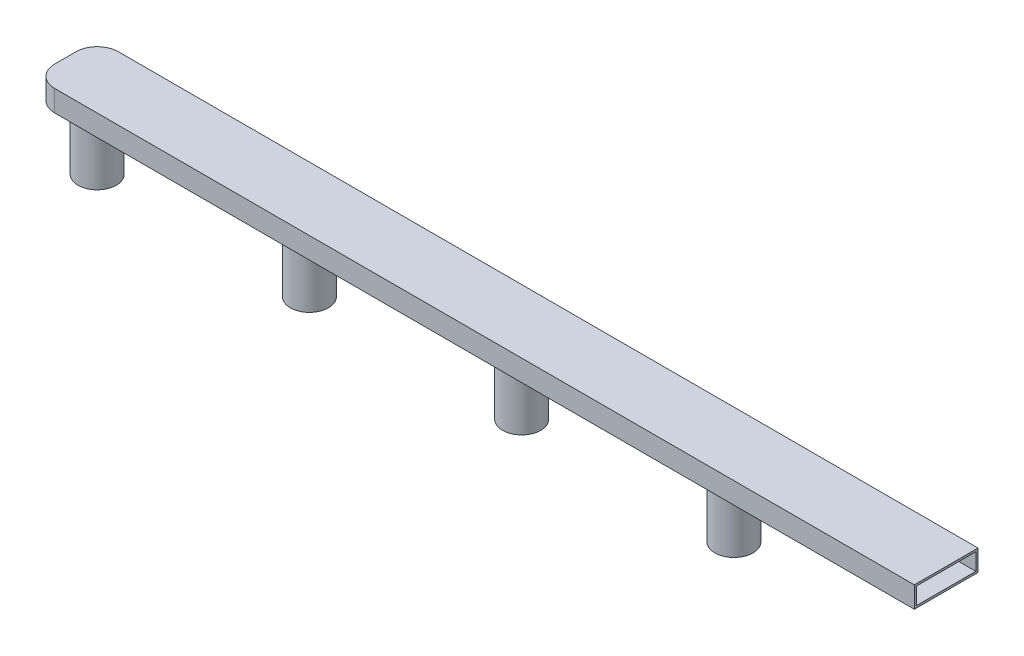
ISO-10303-21;
HEADER;
FILE_DESCRIPTION(('STEP AP214'),'2;1');
FILE_NAME('part.step','',(''),(''),'','','');
FILE_SCHEMA(('AUTOMOTIVE_DESIGN { 1 0 10303 214 1 1 1 1 }'));
ENDSEC;
DATA;
#1=APPLICATION_CONTEXT('core data for automotive mechanical design processes');
#2=APPLICATION_PROTOCOL_DEFINITION('international standard','automotive_design',2000,#1);
#3=PRODUCT_CONTEXT('',#1,'mechanical');
#4=PRODUCT('Part','Part','',(#3));
#5=PRODUCT_RELATED_PRODUCT_CATEGORY('part','',(#4));
#6=PRODUCT_DEFINITION_FORMATION('','',#4);
#7=PRODUCT_DEFINITION_CONTEXT('part definition',#1,'design');
#8=PRODUCT_DEFINITION('design','',#6,#7);
#9=PRODUCT_DEFINITION_SHAPE('','',#8);
#10=(LENGTH_UNIT() NAMED_UNIT(*) SI_UNIT(.MILLI.,.METRE.));
#11=(NAMED_UNIT(*) PLANE_ANGLE_UNIT() SI_UNIT($,.RADIAN.));
#12=(NAMED_UNIT(*) SI_UNIT($,.STERADIAN.) SOLID_ANGLE_UNIT());
#13=UNCERTAINTY_MEASURE_WITH_UNIT(LENGTH_MEASURE(1.E-05),#10,'distance_accuracy_value','');
#14=(GEOMETRIC_REPRESENTATION_CONTEXT(3) GLOBAL_UNCERTAINTY_ASSIGNED_CONTEXT((#13)) GLOBAL_UNIT_ASSIGNED_CONTEXT((#10,
#11,#12)) REPRESENTATION_CONTEXT('',''));
#15=CARTESIAN_POINT('',(0.,0.,0.));
#16=DIRECTION('',(0.,0.,1.));
#17=DIRECTION('',(1.,0.,0.));
#18=AXIS2_PLACEMENT_3D('',#15,#16,#17);
#19=CARTESIAN_POINT('',(250.,10.,-15.));
#20=DIRECTION('',(-1.,0.,0.));
#21=DIRECTION('',(0.,0.,1.));
#22=AXIS2_PLACEMENT_3D('',#19,#20,#21);
#23=PLANE('',#22);
#24=DIRECTION('',(0.,0.,-1.));
#25=VECTOR('',#24,1.);
#26=CARTESIAN_POINT('',(250.,0.,-15.));
#27=LINE('',#26,#25);
#28=CARTESIAN_POINT('',(250.,0.,15.));
#29=VERTEX_POINT('',#28);
#30=CARTESIAN_POINT('',(250.,0.,-15.));
#31=VERTEX_POINT('',#30);
#32=EDGE_CURVE('E151',#29,#31,#27,.T.);
#33=ORIENTED_EDGE('',*,*,#32,.T.);
#34=DIRECTION('',(0.,-1.,0.));
#35=VECTOR('',#34,1.);
#36=CARTESIAN_POINT('',(250.,10.,-15.));
#37=LINE('',#36,#35);
#38=CARTESIAN_POINT('',(250.,10.,-15.));
#39=VERTEX_POINT('',#38);
#40=EDGE_CURVE('E12',#39,#31,#37,.T.);
#41=ORIENTED_EDGE('',*,*,#40,.F.);
#42=DIRECTION('',(0.,0.,-1.));
#43=VECTOR('',#42,1.);
#44=CARTESIAN_POINT('',(250.,10.,-15.));
#45=LINE('',#44,#43);
#46=CARTESIAN_POINT('',(250.,10.,15.));
#47=VERTEX_POINT('',#46);
#48=EDGE_CURVE('E169',#47,#39,#45,.T.);
#49=ORIENTED_EDGE('',*,*,#48,.F.);
#50=DIRECTION('',(0.,-1.,0.));
#51=VECTOR('',#50,1.);
#52=CARTESIAN_POINT('',(250.,10.,15.));
#53=LINE('',#52,#51);
#54=EDGE_CURVE('E147',#47,#29,#53,.T.);
#55=ORIENTED_EDGE('',*,*,#54,.T.);
#56=EDGE_LOOP('',(#33,#41,#49,#55));
#57=FACE_BOUND('',#56,.T.);
#58=DIRECTION('',(0.,0.,-1.));
#59=VECTOR('',#58,1.);
#60=CARTESIAN_POINT('',(250.,0.999999999999999,-15.));
#61=LINE('',#60,#59);
#62=CARTESIAN_POINT('',(250.,1.,14.));
#63=VERTEX_POINT('',#62);
#64=CARTESIAN_POINT('',(250.,1.,-14.));
#65=VERTEX_POINT('',#64);
#66=EDGE_CURVE('E193',#63,#65,#61,.T.);
#67=ORIENTED_EDGE('',*,*,#66,.F.);
#68=DIRECTION('',(0.,-1.,0.));
#69=VECTOR('',#68,1.);
#70=CARTESIAN_POINT('',(250.,10.,14.));
#71=LINE('',#70,#69);
#72=CARTESIAN_POINT('',(250.,9.,14.));
#73=VERTEX_POINT('',#72);
#74=EDGE_CURVE('E199',#73,#63,#71,.T.);
#75=ORIENTED_EDGE('',*,*,#74,.F.);
#76=DIRECTION('',(0.,0.,-1.));
#77=VECTOR('',#76,1.);
#78=CARTESIAN_POINT('',(250.,9.,-15.));
#79=LINE('',#78,#77);
#80=CARTESIAN_POINT('',(250.,9.,-14.));
#81=VERTEX_POINT('',#80);
#82=EDGE_CURVE('E65',#73,#81,#79,.T.);
#83=ORIENTED_EDGE('',*,*,#82,.T.);
#84=DIRECTION('',(0.,-1.,0.));
#85=VECTOR('',#84,1.);
#86=CARTESIAN_POINT('',(250.,10.,-14.));
#87=LINE('',#86,#85);
#88=EDGE_CURVE('E156',#81,#65,#87,.T.);
#89=ORIENTED_EDGE('',*,*,#88,.T.);
#90=EDGE_LOOP('',(#67,#75,#83,#89));
#91=FACE_BOUND('',#90,.T.);
#92=ADVANCED_FACE('F50',(#57,#91),#23,.F.);
#93=CARTESIAN_POINT('',(-155.,10.,-15.));
#94=DIRECTION('',(0.,0.,1.));
#95=DIRECTION('',(1.,0.,0.));
#96=AXIS2_PLACEMENT_3D('',#93,#94,#95);
#97=PLANE('',#96);
#98=DIRECTION('',(-1.,0.,0.));
#99=VECTOR('',#98,1.);
#100=CARTESIAN_POINT('',(-155.,0.,-15.));
#101=LINE('',#100,#99);
#102=CARTESIAN_POINT('',(-155.,0.,-15.));
#103=VERTEX_POINT('',#102);
#104=EDGE_CURVE('E155',#31,#103,#101,.T.);
#105=ORIENTED_EDGE('',*,*,#104,.T.);
#106=DIRECTION('',(0.,-1.,0.));
#107=VECTOR('',#106,1.);
#108=CARTESIAN_POINT('',(-155.,10.,-15.));
#109=LINE('',#108,#107);
#110=CARTESIAN_POINT('',(-155.,10.,-15.));
#111=VERTEX_POINT('',#110);
#112=EDGE_CURVE('E58',#111,#103,#109,.T.);
#113=ORIENTED_EDGE('',*,*,#112,.F.);
#114=DIRECTION('',(-1.,0.,0.));
#115=VECTOR('',#114,1.);
#116=CARTESIAN_POINT('',(-155.,10.,-15.));
#117=LINE('',#116,#115);
#118=EDGE_CURVE('E109',#39,#111,#117,.T.);
#119=ORIENTED_EDGE('',*,*,#118,.F.);
#120=ORIENTED_EDGE('',*,*,#40,.T.);
#121=EDGE_LOOP('',(#105,#113,#119,#120));
#122=FACE_BOUND('',#121,.T.);
#123=ADVANCED_FACE('F303',(#122),#97,.F.);
#124=CARTESIAN_POINT('',(-155.,10.,-5.));
#125=DIRECTION('',(0.,-1.,0.));
#126=DIRECTION('',(0.,0.,-1.));
#127=AXIS2_PLACEMENT_3D('',#124,#125,#126);
#128=CYLINDRICAL_SURFACE('',#127,10.);
#129=CARTESIAN_POINT('',(-155.,0.,-5.));
#130=DIRECTION('',(0.,1.,0.));
#131=DIRECTION('',(0.,0.,1.));
#132=AXIS2_PLACEMENT_3D('',#129,#130,#131);
#133=CIRCLE('',#132,10.);
#134=CARTESIAN_POINT('',(-165.,0.,-5.));
#135=VERTEX_POINT('',#134);
#136=EDGE_CURVE('E159',#103,#135,#133,.T.);
#137=ORIENTED_EDGE('',*,*,#136,.T.);
#138=DIRECTION('',(0.,-1.,0.));
#139=VECTOR('',#138,1.);
#140=CARTESIAN_POINT('',(-165.,10.,-5.));
#141=LINE('',#140,#139);
#142=CARTESIAN_POINT('',(-165.,10.,-5.));
#143=VERTEX_POINT('',#142);
#144=EDGE_CURVE('E140',#143,#135,#141,.T.);
#145=ORIENTED_EDGE('',*,*,#144,.F.);
#146=CARTESIAN_POINT('',(-155.,10.,-5.));
#147=DIRECTION('',(0.,1.,0.));
#148=DIRECTION('',(0.,0.,1.));
#149=AXIS2_PLACEMENT_3D('',#146,#147,#148);
#150=CIRCLE('',#149,10.);
#151=EDGE_CURVE('E126',#111,#143,#150,.T.);
#152=ORIENTED_EDGE('',*,*,#151,.F.);
#153=ORIENTED_EDGE('',*,*,#112,.T.);
#154=EDGE_LOOP('',(#137,#145,#152,#153));
#155=FACE_BOUND('',#154,.T.);
#156=ADVANCED_FACE('F179',(#155),#128,.T.);
#157=CARTESIAN_POINT('',(-165.,10.,-5.));
#158=DIRECTION('',(1.,0.,0.));
#159=DIRECTION('',(0.,0.,-1.));
#160=AXIS2_PLACEMENT_3D('',#157,#158,#159);
#161=PLANE('',#160);
#162=DIRECTION('',(0.,0.,1.));
#163=VECTOR('',#162,1.);
#164=CARTESIAN_POINT('',(-165.,0.,-5.));
#165=LINE('',#164,#163);
#166=CARTESIAN_POINT('',(-165.,0.,5.));
#167=VERTEX_POINT('',#166);
#168=EDGE_CURVE('E136',#135,#167,#165,.T.);
#169=ORIENTED_EDGE('',*,*,#168,.T.);
#170=DIRECTION('',(0.,-1.,0.));
#171=VECTOR('',#170,1.);
#172=CARTESIAN_POINT('',(-165.,10.,5.));
#173=LINE('',#172,#171);
#174=CARTESIAN_POINT('',(-165.,10.,5.));
#175=VERTEX_POINT('',#174);
#176=EDGE_CURVE('E133',#175,#167,#173,.T.);
#177=ORIENTED_EDGE('',*,*,#176,.F.);
#178=DIRECTION('',(0.,0.,1.));
#179=VECTOR('',#178,1.);
#180=CARTESIAN_POINT('',(-165.,10.,-5.));
#181=LINE('',#180,#179);
#182=EDGE_CURVE('E119',#143,#175,#181,.T.);
#183=ORIENTED_EDGE('',*,*,#182,.F.);
#184=ORIENTED_EDGE('',*,*,#144,.T.);
#185=EDGE_LOOP('',(#169,#177,#183,#184));
#186=FACE_BOUND('',#185,.T.);
#187=ADVANCED_FACE('F134',(#186),#161,.F.);
#188=CARTESIAN_POINT('',(-155.,10.,5.));
#189=DIRECTION('',(0.,-1.,0.));
#190=DIRECTION('',(0.,0.,-1.));
#191=AXIS2_PLACEMENT_3D('',#188,#189,#190);
#192=CYLINDRICAL_SURFACE('',#191,10.);
#193=CARTESIAN_POINT('',(-155.,0.,5.));
#194=DIRECTION('',(0.,1.,0.));
#195=DIRECTION('',(0.,0.,1.));
#196=AXIS2_PLACEMENT_3D('',#193,#194,#195);
#197=CIRCLE('',#196,10.);
#198=CARTESIAN_POINT('',(-155.,0.,15.));
#199=VERTEX_POINT('',#198);
#200=EDGE_CURVE('E164',#167,#199,#197,.T.);
#201=ORIENTED_EDGE('',*,*,#200,.T.);
#202=DIRECTION('',(0.,-1.,0.));
#203=VECTOR('',#202,1.);
#204=CARTESIAN_POINT('',(-155.,10.,15.));
#205=LINE('',#204,#203);
#206=CARTESIAN_POINT('',(-155.,10.,15.));
#207=VERTEX_POINT('',#206);
#208=EDGE_CURVE('E141',#207,#199,#205,.T.);
#209=ORIENTED_EDGE('',*,*,#208,.F.);
#210=CARTESIAN_POINT('',(-155.,10.,5.));
#211=DIRECTION('',(0.,1.,0.));
#212=DIRECTION('',(0.,0.,1.));
#213=AXIS2_PLACEMENT_3D('',#210,#211,#212);
#214=CIRCLE('',#213,10.);
#215=EDGE_CURVE('E123',#175,#207,#214,.T.);
#216=ORIENTED_EDGE('',*,*,#215,.F.);
#217=ORIENTED_EDGE('',*,*,#176,.T.);
#218=EDGE_LOOP('',(#201,#209,#216,#217));
#219=FACE_BOUND('',#218,.T.);
#220=ADVANCED_FACE('F143',(#219),#192,.T.);
#221=CARTESIAN_POINT('',(-155.,10.,15.));
#222=DIRECTION('',(0.,0.,-1.));
#223=DIRECTION('',(-1.,0.,0.));
#224=AXIS2_PLACEMENT_3D('',#221,#222,#223);
#225=PLANE('',#224);
#226=DIRECTION('',(1.,0.,0.));
#227=VECTOR('',#226,1.);
#228=CARTESIAN_POINT('',(-155.,0.,15.));
#229=LINE('',#228,#227);
#230=EDGE_CURVE('E101',#199,#29,#229,.T.);
#231=ORIENTED_EDGE('',*,*,#230,.T.);
#232=ORIENTED_EDGE('',*,*,#54,.F.);
#233=DIRECTION('',(1.,0.,0.));
#234=VECTOR('',#233,1.);
#235=CARTESIAN_POINT('',(-155.,10.,15.));
#236=LINE('',#235,#234);
#237=EDGE_CURVE('E74',#207,#47,#236,.T.);
#238=ORIENTED_EDGE('',*,*,#237,.F.);
#239=ORIENTED_EDGE('',*,*,#208,.T.);
#240=EDGE_LOOP('',(#231,#232,#238,#239));
#241=FACE_BOUND('',#240,.T.);
#242=ADVANCED_FACE('F183',(#241),#225,.F.);
#243=CARTESIAN_POINT('',(-155.,10.,5.));
#244=DIRECTION('',(0.,1.,0.));
#245=DIRECTION('',(0.,0.,1.));
#246=AXIS2_PLACEMENT_3D('',#243,#244,#245);
#247=PLANE('',#246);
#248=ORIENTED_EDGE('',*,*,#48,.T.);
#249=ORIENTED_EDGE('',*,*,#118,.T.);
#250=ORIENTED_EDGE('',*,*,#151,.T.);
#251=ORIENTED_EDGE('',*,*,#182,.T.);
#252=ORIENTED_EDGE('',*,*,#215,.T.);
#253=ORIENTED_EDGE('',*,*,#237,.T.);
#254=EDGE_LOOP('',(#248,#249,#250,#251,#252,#253));
#255=FACE_BOUND('',#254,.T.);
#256=ADVANCED_FACE('F121',(#255),#247,.T.);
#257=CARTESIAN_POINT('',(-155.,0.,5.));
#258=DIRECTION('',(0.,1.,0.));
#259=DIRECTION('',(0.,0.,1.));
#260=AXIS2_PLACEMENT_3D('',#257,#258,#259);
#261=PLANE('',#260);
#262=ORIENTED_EDGE('',*,*,#32,.F.);
#263=ORIENTED_EDGE('',*,*,#230,.F.);
#264=ORIENTED_EDGE('',*,*,#200,.F.);
#265=ORIENTED_EDGE('',*,*,#168,.F.);
#266=ORIENTED_EDGE('',*,*,#136,.F.);
#267=ORIENTED_EDGE('',*,*,#104,.F.);
#268=EDGE_LOOP('',(#262,#263,#264,#265,#266,#267));
#269=FACE_BOUND('',#268,.T.);
#270=ADVANCED_FACE('F182',(#269),#261,.F.);
#271=CARTESIAN_POINT('',(-155.,10.,-14.));
#272=DIRECTION('',(0.,0.,1.));
#273=DIRECTION('',(1.,0.,0.));
#274=AXIS2_PLACEMENT_3D('',#271,#272,#273);
#275=PLANE('',#274);
#276=DIRECTION('',(-1.,0.,0.));
#277=VECTOR('',#276,1.);
#278=CARTESIAN_POINT('',(-155.,0.999999999999999,-14.));
#279=LINE('',#278,#277);
#280=CARTESIAN_POINT('',(-155.,0.999999999999999,-14.));
#281=VERTEX_POINT('',#280);
#282=EDGE_CURVE('E198',#65,#281,#279,.T.);
#283=ORIENTED_EDGE('',*,*,#282,.F.);
#284=ORIENTED_EDGE('',*,*,#88,.F.);
#285=DIRECTION('',(-1.,0.,0.));
#286=VECTOR('',#285,1.);
#287=CARTESIAN_POINT('',(-155.,9.,-14.));
#288=LINE('',#287,#286);
#289=CARTESIAN_POINT('',(-155.,9.,-14.));
#290=VERTEX_POINT('',#289);
#291=EDGE_CURVE('E207',#81,#290,#288,.T.);
#292=ORIENTED_EDGE('',*,*,#291,.T.);
#293=DIRECTION('',(0.,-1.,0.));
#294=VECTOR('',#293,1.);
#295=CARTESIAN_POINT('',(-155.,10.,-14.));
#296=LINE('',#295,#294);
#297=EDGE_CURVE('E212',#290,#281,#296,.T.);
#298=ORIENTED_EDGE('',*,*,#297,.T.);
#299=EDGE_LOOP('',(#283,#284,#292,#298));
#300=FACE_BOUND('',#299,.T.);
#301=ADVANCED_FACE('F272',(#300),#275,.T.);
#302=CARTESIAN_POINT('',(-155.,10.,-5.));
#303=DIRECTION('',(0.,-1.,0.));
#304=DIRECTION('',(0.,0.,-1.));
#305=AXIS2_PLACEMENT_3D('',#302,#303,#304);
#306=CYLINDRICAL_SURFACE('',#305,9.00000000000001);
#307=CARTESIAN_POINT('',(-155.,0.999999999999999,-5.));
#308=DIRECTION('',(0.,1.,0.));
#309=DIRECTION('',(0.,0.,1.));
#310=AXIS2_PLACEMENT_3D('',#307,#308,#309);
#311=CIRCLE('',#310,9.00000000000001);
#312=CARTESIAN_POINT('',(-164.,0.999999999999999,-5.));
#313=VERTEX_POINT('',#312);
#314=EDGE_CURVE('E243',#281,#313,#311,.T.);
#315=ORIENTED_EDGE('',*,*,#314,.F.);
#316=ORIENTED_EDGE('',*,*,#297,.F.);
#317=CARTESIAN_POINT('',(-155.,9.,-5.));
#318=DIRECTION('',(0.,1.,0.));
#319=DIRECTION('',(0.,0.,1.));
#320=AXIS2_PLACEMENT_3D('',#317,#318,#319);
#321=CIRCLE('',#320,9.00000000000001);
#322=CARTESIAN_POINT('',(-164.,9.,-5.));
#323=VERTEX_POINT('',#322);
#324=EDGE_CURVE('E235',#290,#323,#321,.T.);
#325=ORIENTED_EDGE('',*,*,#324,.T.);
#326=DIRECTION('',(0.,1.,0.));
#327=VECTOR('',#326,1.);
#328=CARTESIAN_POINT('',(-164.,10.,-5.));
#329=LINE('',#328,#327);
#330=EDGE_CURVE('E239',#323,#313,#329,.F.);
#331=ORIENTED_EDGE('',*,*,#330,.T.);
#332=EDGE_LOOP('',(#315,#316,#325,#331));
#333=FACE_BOUND('',#332,.T.);
#334=ADVANCED_FACE('F276',(#333),#306,.F.);
#335=CARTESIAN_POINT('',(-164.,10.,-5.));
#336=DIRECTION('',(1.,0.,0.));
#337=DIRECTION('',(0.,0.,-1.));
#338=AXIS2_PLACEMENT_3D('',#335,#336,#337);
#339=PLANE('',#338);
#340=DIRECTION('',(0.,0.,1.));
#341=VECTOR('',#340,1.);
#342=CARTESIAN_POINT('',(-164.,0.999999999999999,-5.));
#343=LINE('',#342,#341);
#344=CARTESIAN_POINT('',(-164.,0.999999999999999,5.));
#345=VERTEX_POINT('',#344);
#346=EDGE_CURVE('E231',#313,#345,#343,.T.);
#347=ORIENTED_EDGE('',*,*,#346,.F.);
#348=ORIENTED_EDGE('',*,*,#330,.F.);
#349=DIRECTION('',(0.,0.,1.));
#350=VECTOR('',#349,1.);
#351=CARTESIAN_POINT('',(-164.,9.,-5.));
#352=LINE('',#351,#350);
#353=CARTESIAN_POINT('',(-164.,9.,5.));
#354=VERTEX_POINT('',#353);
#355=EDGE_CURVE('E223',#323,#354,#352,.T.);
#356=ORIENTED_EDGE('',*,*,#355,.T.);
#357=DIRECTION('',(0.,-1.,0.));
#358=VECTOR('',#357,1.);
#359=CARTESIAN_POINT('',(-164.,10.,5.));
#360=LINE('',#359,#358);
#361=EDGE_CURVE('E227',#354,#345,#360,.T.);
#362=ORIENTED_EDGE('',*,*,#361,.T.);
#363=EDGE_LOOP('',(#347,#348,#356,#362));
#364=FACE_BOUND('',#363,.T.);
#365=ADVANCED_FACE('F284',(#364),#339,.T.);
#366=CARTESIAN_POINT('',(-155.,10.,5.));
#367=DIRECTION('',(0.,-1.,0.));
#368=DIRECTION('',(0.,0.,-1.));
#369=AXIS2_PLACEMENT_3D('',#366,#367,#368);
#370=CYLINDRICAL_SURFACE('',#369,9.00000000000001);
#371=CARTESIAN_POINT('',(-155.,0.999999999999999,5.));
#372=DIRECTION('',(0.,1.,0.));
#373=DIRECTION('',(0.,0.,1.));
#374=AXIS2_PLACEMENT_3D('',#371,#372,#373);
#375=CIRCLE('',#374,9.00000000000001);
#376=CARTESIAN_POINT('',(-155.,0.999999999999999,14.));
#377=VERTEX_POINT('',#376);
#378=EDGE_CURVE('E219',#345,#377,#375,.T.);
#379=ORIENTED_EDGE('',*,*,#378,.F.);
#380=ORIENTED_EDGE('',*,*,#361,.F.);
#381=CARTESIAN_POINT('',(-155.,9.,5.));
#382=DIRECTION('',(0.,1.,0.));
#383=DIRECTION('',(0.,0.,1.));
#384=AXIS2_PLACEMENT_3D('',#381,#382,#383);
#385=CIRCLE('',#384,9.00000000000001);
#386=CARTESIAN_POINT('',(-155.,9.,14.));
#387=VERTEX_POINT('',#386);
#388=EDGE_CURVE('E215',#354,#387,#385,.T.);
#389=ORIENTED_EDGE('',*,*,#388,.T.);
#390=DIRECTION('',(0.,1.,0.));
#391=VECTOR('',#390,1.);
#392=CARTESIAN_POINT('',(-155.,10.,14.));
#393=LINE('',#392,#391);
#394=EDGE_CURVE('E203',#387,#377,#393,.F.);
#395=ORIENTED_EDGE('',*,*,#394,.T.);
#396=EDGE_LOOP('',(#379,#380,#389,#395));
#397=FACE_BOUND('',#396,.T.);
#398=ADVANCED_FACE('F329',(#397),#370,.F.);
#399=CARTESIAN_POINT('',(-155.,10.,14.));
#400=DIRECTION('',(0.,0.,-1.));
#401=DIRECTION('',(-1.,0.,0.));
#402=AXIS2_PLACEMENT_3D('',#399,#400,#401);
#403=PLANE('',#402);
#404=DIRECTION('',(1.,0.,0.));
#405=VECTOR('',#404,1.);
#406=CARTESIAN_POINT('',(-155.,0.999999999999999,14.));
#407=LINE('',#406,#405);
#408=EDGE_CURVE('E208',#377,#63,#407,.T.);
#409=ORIENTED_EDGE('',*,*,#408,.F.);
#410=ORIENTED_EDGE('',*,*,#394,.F.);
#411=DIRECTION('',(1.,0.,0.));
#412=VECTOR('',#411,1.);
#413=CARTESIAN_POINT('',(-155.,9.,14.));
#414=LINE('',#413,#412);
#415=EDGE_CURVE('E204',#387,#73,#414,.T.);
#416=ORIENTED_EDGE('',*,*,#415,.T.);
#417=ORIENTED_EDGE('',*,*,#74,.T.);
#418=EDGE_LOOP('',(#409,#410,#416,#417));
#419=FACE_BOUND('',#418,.T.);
#420=ADVANCED_FACE('F301',(#419),#403,.T.);
#421=CARTESIAN_POINT('',(-155.,9.,5.));
#422=DIRECTION('',(0.,1.,0.));
#423=DIRECTION('',(0.,0.,1.));
#424=AXIS2_PLACEMENT_3D('',#421,#422,#423);
#425=PLANE('',#424);
#426=ORIENTED_EDGE('',*,*,#82,.F.);
#427=ORIENTED_EDGE('',*,*,#415,.F.);
#428=ORIENTED_EDGE('',*,*,#388,.F.);
#429=ORIENTED_EDGE('',*,*,#355,.F.);
#430=ORIENTED_EDGE('',*,*,#324,.F.);
#431=ORIENTED_EDGE('',*,*,#291,.F.);
#432=EDGE_LOOP('',(#426,#427,#428,#429,#430,#431));
#433=FACE_BOUND('',#432,.T.);
#434=ADVANCED_FACE('F324',(#433),#425,.F.);
#435=CARTESIAN_POINT('',(-155.,1.,5.));
#436=DIRECTION('',(0.,1.,0.));
#437=DIRECTION('',(0.,0.,1.));
#438=AXIS2_PLACEMENT_3D('',#435,#436,#437);
#439=PLANE('',#438);
#440=ORIENTED_EDGE('',*,*,#66,.T.);
#441=ORIENTED_EDGE('',*,*,#282,.T.);
#442=ORIENTED_EDGE('',*,*,#314,.T.);
#443=ORIENTED_EDGE('',*,*,#346,.T.);
#444=ORIENTED_EDGE('',*,*,#378,.T.);
#445=ORIENTED_EDGE('',*,*,#408,.T.);
#446=EDGE_LOOP('',(#440,#441,#442,#443,#444,#445));
#447=FACE_BOUND('',#446,.T.);
#448=ADVANCED_FACE('F264',(#447),#439,.T.);
#449=CLOSED_SHELL('',(#92,#123,#156,#187,#220,#242,#256,#270,#301,#334,#365,#398,#420,#434,#448));
#450=MANIFOLD_SOLID_BREP('B2',#449);
#451=CARTESIAN_POINT('',(-150.,-30.,0.));
#452=DIRECTION('',(0.,1.,0.));
#453=DIRECTION('',(0.,0.,1.));
#454=AXIS2_PLACEMENT_3D('',#451,#452,#453);
#455=CYLINDRICAL_SURFACE('',#454,9.00000000000001);
#456=CARTESIAN_POINT('',(-150.,-30.,0.));
#457=DIRECTION('',(0.,1.,0.));
#458=DIRECTION('',(0.,0.,1.));
#459=AXIS2_PLACEMENT_3D('',#456,#457,#458);
#460=CIRCLE('',#459,9.00000000000001);
#461=CARTESIAN_POINT('',(-150.,-30.,9.00000000000001));
#462=VERTEX_POINT('',#461);
#463=EDGE_CURVE('E49',#462,#462,#460,.T.);
#464=ORIENTED_EDGE('',*,*,#463,.T.);
#465=EDGE_LOOP('',(#464));
#466=FACE_BOUND('',#465,.T.);
#467=CARTESIAN_POINT('',(-150.,0.,0.));
#468=DIRECTION('',(0.,1.,0.));
#469=DIRECTION('',(0.,0.,1.));
#470=AXIS2_PLACEMENT_3D('',#467,#468,#469);
#471=CIRCLE('',#470,9.00000000000001);
#472=CARTESIAN_POINT('',(-150.,0.,9.00000000000001));
#473=VERTEX_POINT('',#472);
#474=EDGE_CURVE('E440',#473,#473,#471,.T.);
#475=ORIENTED_EDGE('',*,*,#474,.F.);
#476=EDGE_LOOP('',(#475));
#477=FACE_BOUND('',#476,.T.);
#478=ADVANCED_FACE('F437',(#466,#477),#455,.T.);
#479=CARTESIAN_POINT('',(-150.,-30.,0.));
#480=DIRECTION('',(0.,1.,0.));
#481=DIRECTION('',(0.,0.,1.));
#482=AXIS2_PLACEMENT_3D('',#479,#480,#481);
#483=PLANE('',#482);
#484=CARTESIAN_POINT('',(-150.,-30.,0.));
#485=DIRECTION('',(0.,1.,0.));
#486=DIRECTION('',(0.,0.,1.));
#487=AXIS2_PLACEMENT_3D('',#484,#485,#486);
#488=CIRCLE('',#487,6.50000000000002);
#489=CARTESIAN_POINT('',(-150.,-30.,6.50000000000002));
#490=VERTEX_POINT('',#489);
#491=EDGE_CURVE('E447',#490,#490,#488,.T.);
#492=ORIENTED_EDGE('',*,*,#491,.T.);
#493=EDGE_LOOP('',(#492));
#494=FACE_BOUND('',#493,.T.);
#495=ORIENTED_EDGE('',*,*,#463,.F.);
#496=EDGE_LOOP('',(#495));
#497=FACE_BOUND('',#496,.T.);
#498=ADVANCED_FACE('F455',(#494,#497),#483,.F.);
#499=CARTESIAN_POINT('',(-150.,0.,0.));
#500=DIRECTION('',(0.,1.,0.));
#501=DIRECTION('',(0.,0.,1.));
#502=AXIS2_PLACEMENT_3D('',#499,#500,#501);
#503=PLANE('',#502);
#504=CARTESIAN_POINT('',(-150.,0.,0.));
#505=DIRECTION('',(0.,1.,0.));
#506=DIRECTION('',(0.,0.,1.));
#507=AXIS2_PLACEMENT_3D('',#504,#505,#506);
#508=CIRCLE('',#507,6.50000000000002);
#509=CARTESIAN_POINT('',(-150.,0.,6.50000000000002));
#510=VERTEX_POINT('',#509);
#511=EDGE_CURVE('E449',#510,#510,#508,.T.);
#512=ORIENTED_EDGE('',*,*,#511,.F.);
#513=EDGE_LOOP('',(#512));
#514=FACE_BOUND('',#513,.T.);
#515=ORIENTED_EDGE('',*,*,#474,.T.);
#516=EDGE_LOOP('',(#515));
#517=FACE_BOUND('',#516,.T.);
#518=ADVANCED_FACE('F461',(#514,#517),#503,.T.);
#519=CARTESIAN_POINT('',(-150.,-30.,0.));
#520=DIRECTION('',(0.,1.,0.));
#521=DIRECTION('',(0.,0.,1.));
#522=AXIS2_PLACEMENT_3D('',#519,#520,#521);
#523=CYLINDRICAL_SURFACE('',#522,6.50000000000002);
#524=ORIENTED_EDGE('',*,*,#491,.F.);
#525=EDGE_LOOP('',(#524));
#526=FACE_BOUND('',#525,.T.);
#527=ORIENTED_EDGE('',*,*,#511,.T.);
#528=EDGE_LOOP('',(#527));
#529=FACE_BOUND('',#528,.T.);
#530=ADVANCED_FACE('F458',(#526,#529),#523,.F.);
#531=CLOSED_SHELL('',(#478,#498,#518,#530));
#532=MANIFOLD_SOLID_BREP('B6',#531);
#533=CARTESIAN_POINT('',(150.,-30.,0.));
#534=DIRECTION('',(0.,1.,0.));
#535=DIRECTION('',(0.,0.,1.));
#536=AXIS2_PLACEMENT_3D('',#533,#534,#535);
#537=CYLINDRICAL_SURFACE('',#536,9.00000000000001);
#538=CARTESIAN_POINT('',(150.,-30.,0.));
#539=DIRECTION('',(0.,1.,0.));
#540=DIRECTION('',(0.,0.,1.));
#541=AXIS2_PLACEMENT_3D('',#538,#539,#540);
#542=CIRCLE('',#541,9.00000000000001);
#543=CARTESIAN_POINT('',(150.,-30.,9.00000000000001));
#544=VERTEX_POINT('',#543);
#545=EDGE_CURVE('E436',#544,#544,#542,.T.);
#546=ORIENTED_EDGE('',*,*,#545,.T.);
#547=EDGE_LOOP('',(#546));
#548=FACE_BOUND('',#547,.T.);
#549=CARTESIAN_POINT('',(150.,0.,0.));
#550=DIRECTION('',(0.,1.,0.));
#551=DIRECTION('',(0.,0.,1.));
#552=AXIS2_PLACEMENT_3D('',#549,#550,#551);
#553=CIRCLE('',#552,9.00000000000001);
#554=CARTESIAN_POINT('',(150.,0.,9.00000000000001));
#555=VERTEX_POINT('',#554);
#556=EDGE_CURVE('E510',#555,#555,#553,.T.);
#557=ORIENTED_EDGE('',*,*,#556,.F.);
#558=EDGE_LOOP('',(#557));
#559=FACE_BOUND('',#558,.T.);
#560=ADVANCED_FACE('F507',(#548,#559),#537,.T.);
#561=CARTESIAN_POINT('',(150.,-30.,0.));
#562=DIRECTION('',(0.,1.,0.));
#563=DIRECTION('',(0.,0.,1.));
#564=AXIS2_PLACEMENT_3D('',#561,#562,#563);
#565=PLANE('',#564);
#566=CARTESIAN_POINT('',(150.,-30.,0.));
#567=DIRECTION('',(0.,1.,0.));
#568=DIRECTION('',(0.,0.,1.));
#569=AXIS2_PLACEMENT_3D('',#566,#567,#568);
#570=CIRCLE('',#569,6.50000000000002);
#571=CARTESIAN_POINT('',(150.,-30.,6.50000000000002));
#572=VERTEX_POINT('',#571);
#573=EDGE_CURVE('E517',#572,#572,#570,.T.);
#574=ORIENTED_EDGE('',*,*,#573,.T.);
#575=EDGE_LOOP('',(#574));
#576=FACE_BOUND('',#575,.T.);
#577=ORIENTED_EDGE('',*,*,#545,.F.);
#578=EDGE_LOOP('',(#577));
#579=FACE_BOUND('',#578,.T.);
#580=ADVANCED_FACE('F525',(#576,#579),#565,.F.);
#581=CARTESIAN_POINT('',(150.,0.,0.));
#582=DIRECTION('',(0.,1.,0.));
#583=DIRECTION('',(0.,0.,1.));
#584=AXIS2_PLACEMENT_3D('',#581,#582,#583);
#585=PLANE('',#584);
#586=CARTESIAN_POINT('',(150.,0.,0.));
#587=DIRECTION('',(0.,1.,0.));
#588=DIRECTION('',(0.,0.,1.));
#589=AXIS2_PLACEMENT_3D('',#586,#587,#588);
#590=CIRCLE('',#589,6.50000000000002);
#591=CARTESIAN_POINT('',(150.,0.,6.50000000000002));
#592=VERTEX_POINT('',#591);
#593=EDGE_CURVE('E519',#592,#592,#590,.T.);
#594=ORIENTED_EDGE('',*,*,#593,.F.);
#595=EDGE_LOOP('',(#594));
#596=FACE_BOUND('',#595,.T.);
#597=ORIENTED_EDGE('',*,*,#556,.T.);
#598=EDGE_LOOP('',(#597));
#599=FACE_BOUND('',#598,.T.);
#600=ADVANCED_FACE('F531',(#596,#599),#585,.T.);
#601=CARTESIAN_POINT('',(150.,-30.,0.));
#602=DIRECTION('',(0.,1.,0.));
#603=DIRECTION('',(0.,0.,1.));
#604=AXIS2_PLACEMENT_3D('',#601,#602,#603);
#605=CYLINDRICAL_SURFACE('',#604,6.50000000000002);
#606=ORIENTED_EDGE('',*,*,#573,.F.);
#607=EDGE_LOOP('',(#606));
#608=FACE_BOUND('',#607,.T.);
#609=ORIENTED_EDGE('',*,*,#593,.T.);
#610=EDGE_LOOP('',(#609));
#611=FACE_BOUND('',#610,.T.);
#612=ADVANCED_FACE('F528',(#608,#611),#605,.F.);
#613=CLOSED_SHELL('',(#560,#580,#600,#612));
#614=MANIFOLD_SOLID_BREP('B44',#613);
#615=CARTESIAN_POINT('',(50.,-30.,0.));
#616=DIRECTION('',(0.,1.,0.));
#617=DIRECTION('',(0.,0.,1.));
#618=AXIS2_PLACEMENT_3D('',#615,#616,#617);
#619=CYLINDRICAL_SURFACE('',#618,9.);
#620=CARTESIAN_POINT('',(50.,-30.,0.));
#621=DIRECTION('',(0.,1.,0.));
#622=DIRECTION('',(0.,0.,1.));
#623=AXIS2_PLACEMENT_3D('',#620,#621,#622);
#624=CIRCLE('',#623,9.);
#625=CARTESIAN_POINT('',(50.,-30.,9.));
#626=VERTEX_POINT('',#625);
#627=EDGE_CURVE('E506',#626,#626,#624,.T.);
#628=ORIENTED_EDGE('',*,*,#627,.T.);
#629=EDGE_LOOP('',(#628));
#630=FACE_BOUND('',#629,.T.);
#631=CARTESIAN_POINT('',(50.,0.,0.));
#632=DIRECTION('',(0.,1.,0.));
#633=DIRECTION('',(0.,0.,1.));
#634=AXIS2_PLACEMENT_3D('',#631,#632,#633);
#635=CIRCLE('',#634,9.);
#636=CARTESIAN_POINT('',(50.,0.,9.));
#637=VERTEX_POINT('',#636);
#638=EDGE_CURVE('E579',#637,#637,#635,.T.);
#639=ORIENTED_EDGE('',*,*,#638,.F.);
#640=EDGE_LOOP('',(#639));
#641=FACE_BOUND('',#640,.T.);
#642=ADVANCED_FACE('F576',(#630,#641),#619,.T.);
#643=CARTESIAN_POINT('',(50.,-30.,0.));
#644=DIRECTION('',(0.,1.,0.));
#645=DIRECTION('',(0.,0.,1.));
#646=AXIS2_PLACEMENT_3D('',#643,#644,#645);
#647=PLANE('',#646);
#648=CARTESIAN_POINT('',(50.,-30.,0.));
#649=DIRECTION('',(0.,1.,0.));
#650=DIRECTION('',(0.,0.,1.));
#651=AXIS2_PLACEMENT_3D('',#648,#649,#650);
#652=CIRCLE('',#651,6.5);
#653=CARTESIAN_POINT('',(50.,-30.,6.5));
#654=VERTEX_POINT('',#653);
#655=EDGE_CURVE('E586',#654,#654,#652,.T.);
#656=ORIENTED_EDGE('',*,*,#655,.T.);
#657=EDGE_LOOP('',(#656));
#658=FACE_BOUND('',#657,.T.);
#659=ORIENTED_EDGE('',*,*,#627,.F.);
#660=EDGE_LOOP('',(#659));
#661=FACE_BOUND('',#660,.T.);
#662=ADVANCED_FACE('F594',(#658,#661),#647,.F.);
#663=CARTESIAN_POINT('',(50.,0.,0.));
#664=DIRECTION('',(0.,1.,0.));
#665=DIRECTION('',(0.,0.,1.));
#666=AXIS2_PLACEMENT_3D('',#663,#664,#665);
#667=PLANE('',#666);
#668=CARTESIAN_POINT('',(50.,0.,0.));
#669=DIRECTION('',(0.,1.,0.));
#670=DIRECTION('',(0.,0.,1.));
#671=AXIS2_PLACEMENT_3D('',#668,#669,#670);
#672=CIRCLE('',#671,6.5);
#673=CARTESIAN_POINT('',(50.,0.,6.5));
#674=VERTEX_POINT('',#673);
#675=EDGE_CURVE('E588',#674,#674,#672,.T.);
#676=ORIENTED_EDGE('',*,*,#675,.F.);
#677=EDGE_LOOP('',(#676));
#678=FACE_BOUND('',#677,.T.);
#679=ORIENTED_EDGE('',*,*,#638,.T.);
#680=EDGE_LOOP('',(#679));
#681=FACE_BOUND('',#680,.T.);
#682=ADVANCED_FACE('F600',(#678,#681),#667,.T.);
#683=CARTESIAN_POINT('',(50.,-30.,0.));
#684=DIRECTION('',(0.,1.,0.));
#685=DIRECTION('',(0.,0.,1.));
#686=AXIS2_PLACEMENT_3D('',#683,#684,#685);
#687=CYLINDRICAL_SURFACE('',#686,6.5);
#688=ORIENTED_EDGE('',*,*,#655,.F.);
#689=EDGE_LOOP('',(#688));
#690=FACE_BOUND('',#689,.T.);
#691=ORIENTED_EDGE('',*,*,#675,.T.);
#692=EDGE_LOOP('',(#691));
#693=FACE_BOUND('',#692,.T.);
#694=ADVANCED_FACE('F597',(#690,#693),#687,.F.);
#695=CLOSED_SHELL('',(#642,#662,#682,#694));
#696=MANIFOLD_SOLID_BREP('B431',#695);
#697=CARTESIAN_POINT('',(-50.,-30.,0.));
#698=DIRECTION('',(0.,1.,0.));
#699=DIRECTION('',(0.,0.,1.));
#700=AXIS2_PLACEMENT_3D('',#697,#698,#699);
#701=CYLINDRICAL_SURFACE('',#700,9.);
#702=CARTESIAN_POINT('',(-50.,-30.,0.));
#703=DIRECTION('',(0.,1.,0.));
#704=DIRECTION('',(0.,0.,1.));
#705=AXIS2_PLACEMENT_3D('',#702,#703,#704);
#706=CIRCLE('',#705,9.);
#707=CARTESIAN_POINT('',(-50.,-30.,9.));
#708=VERTEX_POINT('',#707);
#709=EDGE_CURVE('E575',#708,#708,#706,.T.);
#710=ORIENTED_EDGE('',*,*,#709,.T.);
#711=EDGE_LOOP('',(#710));
#712=FACE_BOUND('',#711,.T.);
#713=CARTESIAN_POINT('',(-50.,0.,0.));
#714=DIRECTION('',(0.,1.,0.));
#715=DIRECTION('',(0.,0.,1.));
#716=AXIS2_PLACEMENT_3D('',#713,#714,#715);
#717=CIRCLE('',#716,9.);
#718=CARTESIAN_POINT('',(-50.,0.,9.));
#719=VERTEX_POINT('',#718);
#720=EDGE_CURVE('E641',#719,#719,#717,.T.);
#721=ORIENTED_EDGE('',*,*,#720,.F.);
#722=EDGE_LOOP('',(#721));
#723=FACE_BOUND('',#722,.T.);
#724=ADVANCED_FACE('F638',(#712,#723),#701,.T.);
#725=CARTESIAN_POINT('',(-50.,-30.,0.));
#726=DIRECTION('',(0.,1.,0.));
#727=DIRECTION('',(0.,0.,1.));
#728=AXIS2_PLACEMENT_3D('',#725,#726,#727);
#729=PLANE('',#728);
#730=CARTESIAN_POINT('',(-50.,-30.,0.));
#731=DIRECTION('',(0.,1.,0.));
#732=DIRECTION('',(0.,0.,1.));
#733=AXIS2_PLACEMENT_3D('',#730,#731,#732);
#734=CIRCLE('',#733,6.5);
#735=CARTESIAN_POINT('',(-50.,-30.,6.5));
#736=VERTEX_POINT('',#735);
#737=EDGE_CURVE('E648',#736,#736,#734,.T.);
#738=ORIENTED_EDGE('',*,*,#737,.T.);
#739=EDGE_LOOP('',(#738));
#740=FACE_BOUND('',#739,.T.);
#741=ORIENTED_EDGE('',*,*,#709,.F.);
#742=EDGE_LOOP('',(#741));
#743=FACE_BOUND('',#742,.T.);
#744=ADVANCED_FACE('F656',(#740,#743),#729,.F.);
#745=CARTESIAN_POINT('',(-50.,0.,0.));
#746=DIRECTION('',(0.,1.,0.));
#747=DIRECTION('',(0.,0.,1.));
#748=AXIS2_PLACEMENT_3D('',#745,#746,#747);
#749=PLANE('',#748);
#750=CARTESIAN_POINT('',(-50.,0.,0.));
#751=DIRECTION('',(0.,1.,0.));
#752=DIRECTION('',(0.,0.,1.));
#753=AXIS2_PLACEMENT_3D('',#750,#751,#752);
#754=CIRCLE('',#753,6.5);
#755=CARTESIAN_POINT('',(-50.,0.,6.5));
#756=VERTEX_POINT('',#755);
#757=EDGE_CURVE('E650',#756,#756,#754,.T.);
#758=ORIENTED_EDGE('',*,*,#757,.F.);
#759=EDGE_LOOP('',(#758));
#760=FACE_BOUND('',#759,.T.);
#761=ORIENTED_EDGE('',*,*,#720,.T.);
#762=EDGE_LOOP('',(#761));
#763=FACE_BOUND('',#762,.T.);
#764=ADVANCED_FACE('F662',(#760,#763),#749,.T.);
#765=CARTESIAN_POINT('',(-50.,-30.,0.));
#766=DIRECTION('',(0.,1.,0.));
#767=DIRECTION('',(0.,0.,1.));
#768=AXIS2_PLACEMENT_3D('',#765,#766,#767);
#769=CYLINDRICAL_SURFACE('',#768,6.5);
#770=ORIENTED_EDGE('',*,*,#737,.F.);
#771=EDGE_LOOP('',(#770));
#772=FACE_BOUND('',#771,.T.);
#773=ORIENTED_EDGE('',*,*,#757,.T.);
#774=EDGE_LOOP('',(#773));
#775=FACE_BOUND('',#774,.T.);
#776=ADVANCED_FACE('F659',(#772,#775),#769,.F.);
#777=CLOSED_SHELL('',(#724,#744,#764,#776));
#778=MANIFOLD_SOLID_BREP('B501',#777);
#779=ADVANCED_BREP_SHAPE_REPRESENTATION('',(#18,#450,#532,#614,#696,#778),#14);
#780=SHAPE_DEFINITION_REPRESENTATION(#9,#779);
ENDSEC;
END-ISO-10303-21;
